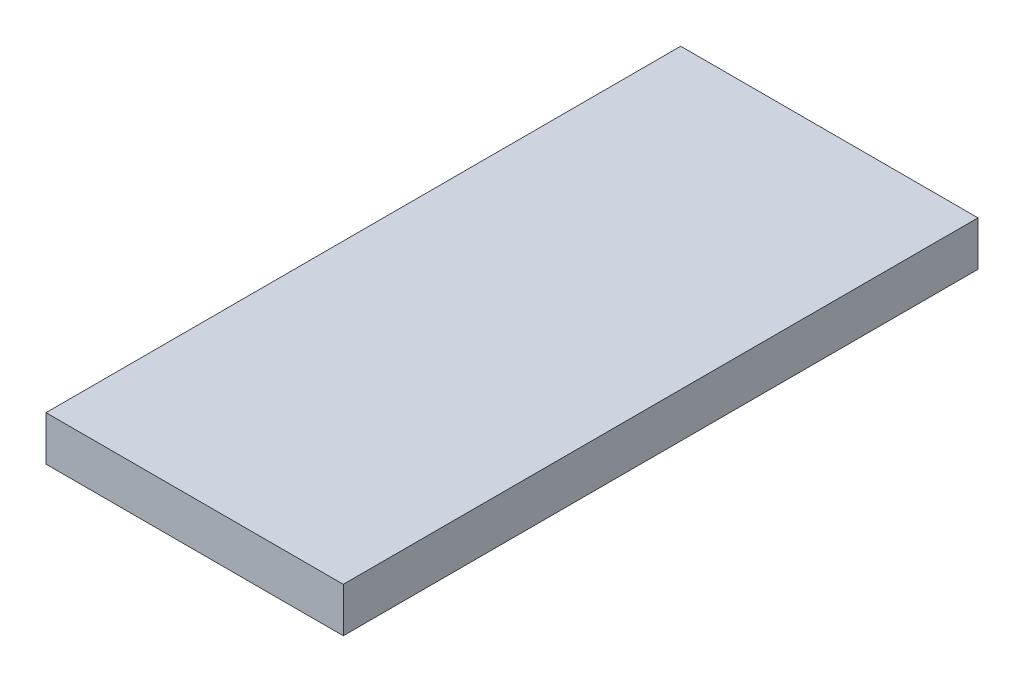
ISO-10303-21;
HEADER;
FILE_DESCRIPTION(('STEP AP214'),'2;1');
FILE_NAME('part.step','',(''),(''),'','','');
FILE_SCHEMA(('AUTOMOTIVE_DESIGN { 1 0 10303 214 1 1 1 1 }'));
ENDSEC;
DATA;
#1=APPLICATION_CONTEXT('core data for automotive mechanical design processes');
#2=APPLICATION_PROTOCOL_DEFINITION('international standard','automotive_design',2000,#1);
#3=PRODUCT_CONTEXT('',#1,'mechanical');
#4=PRODUCT('Part','Part','',(#3));
#5=PRODUCT_RELATED_PRODUCT_CATEGORY('part','',(#4));
#6=PRODUCT_DEFINITION_FORMATION('','',#4);
#7=PRODUCT_DEFINITION_CONTEXT('part definition',#1,'design');
#8=PRODUCT_DEFINITION('design','',#6,#7);
#9=PRODUCT_DEFINITION_SHAPE('','',#8);
#10=(LENGTH_UNIT() NAMED_UNIT(*) SI_UNIT(.MILLI.,.METRE.));
#11=(NAMED_UNIT(*) PLANE_ANGLE_UNIT() SI_UNIT($,.RADIAN.));
#12=(NAMED_UNIT(*) SI_UNIT($,.STERADIAN.) SOLID_ANGLE_UNIT());
#13=UNCERTAINTY_MEASURE_WITH_UNIT(LENGTH_MEASURE(1.E-05),#10,'distance_accuracy_value','');
#14=(GEOMETRIC_REPRESENTATION_CONTEXT(3) GLOBAL_UNCERTAINTY_ASSIGNED_CONTEXT((#13)) GLOBAL_UNIT_ASSIGNED_CONTEXT((#10,
#11,#12)) REPRESENTATION_CONTEXT('',''));
#15=CARTESIAN_POINT('',(0.,0.,0.));
#16=DIRECTION('',(0.,0.,1.));
#17=DIRECTION('',(1.,0.,0.));
#18=AXIS2_PLACEMENT_3D('',#15,#16,#17);
#19=CARTESIAN_POINT('',(50.,-7.5,213.5));
#20=DIRECTION('',(-1.,0.,0.));
#21=DIRECTION('',(0.,0.,1.));
#22=AXIS2_PLACEMENT_3D('',#19,#20,#21);
#23=PLANE('',#22);
#24=DIRECTION('',(0.,1.,0.));
#25=VECTOR('',#24,1.);
#26=CARTESIAN_POINT('',(50.,-7.5,0.));
#27=LINE('',#26,#25);
#28=CARTESIAN_POINT('',(50.,-7.5,0.));
#29=VERTEX_POINT('',#28);
#30=CARTESIAN_POINT('',(50.,7.5,0.));
#31=VERTEX_POINT('',#30);
#32=EDGE_CURVE('E105',#29,#31,#27,.T.);
#33=ORIENTED_EDGE('',*,*,#32,.T.);
#34=DIRECTION('',(0.,0.,-1.));
#35=VECTOR('',#34,1.);
#36=CARTESIAN_POINT('',(50.,7.5,213.5));
#37=LINE('',#36,#35);
#38=CARTESIAN_POINT('',(50.,7.5,213.5));
#39=VERTEX_POINT('',#38);
#40=EDGE_CURVE('E11',#39,#31,#37,.T.);
#41=ORIENTED_EDGE('',*,*,#40,.F.);
#42=DIRECTION('',(0.,1.,0.));
#43=VECTOR('',#42,1.);
#44=CARTESIAN_POINT('',(50.,-7.5,213.5));
#45=LINE('',#44,#43);
#46=CARTESIAN_POINT('',(50.,-7.5,213.5));
#47=VERTEX_POINT('',#46);
#48=EDGE_CURVE('E89',#47,#39,#45,.T.);
#49=ORIENTED_EDGE('',*,*,#48,.F.);
#50=DIRECTION('',(0.,0.,-1.));
#51=VECTOR('',#50,1.);
#52=CARTESIAN_POINT('',(50.,-7.5,213.5));
#53=LINE('',#52,#51);
#54=EDGE_CURVE('E98',#47,#29,#53,.T.);
#55=ORIENTED_EDGE('',*,*,#54,.T.);
#56=EDGE_LOOP('',(#33,#41,#49,#55));
#57=FACE_BOUND('',#56,.T.);
#58=ADVANCED_FACE('F39',(#57),#23,.F.);
#59=CARTESIAN_POINT('',(-50.,7.5,213.5));
#60=DIRECTION('',(0.,-1.,0.));
#61=DIRECTION('',(0.,0.,-1.));
#62=AXIS2_PLACEMENT_3D('',#59,#60,#61);
#63=PLANE('',#62);
#64=DIRECTION('',(-1.,0.,0.));
#65=VECTOR('',#64,1.);
#66=CARTESIAN_POINT('',(-50.,7.5,0.));
#67=LINE('',#66,#65);
#68=CARTESIAN_POINT('',(-50.,7.5,0.));
#69=VERTEX_POINT('',#68);
#70=EDGE_CURVE('E94',#31,#69,#67,.T.);
#71=ORIENTED_EDGE('',*,*,#70,.T.);
#72=DIRECTION('',(0.,0.,-1.));
#73=VECTOR('',#72,1.);
#74=CARTESIAN_POINT('',(-50.,7.5,213.5));
#75=LINE('',#74,#73);
#76=CARTESIAN_POINT('',(-50.,7.5,213.5));
#77=VERTEX_POINT('',#76);
#78=EDGE_CURVE('E50',#77,#69,#75,.T.);
#79=ORIENTED_EDGE('',*,*,#78,.F.);
#80=DIRECTION('',(-1.,0.,0.));
#81=VECTOR('',#80,1.);
#82=CARTESIAN_POINT('',(-50.,7.5,213.5));
#83=LINE('',#82,#81);
#84=EDGE_CURVE('E81',#39,#77,#83,.T.);
#85=ORIENTED_EDGE('',*,*,#84,.F.);
#86=ORIENTED_EDGE('',*,*,#40,.T.);
#87=EDGE_LOOP('',(#71,#79,#85,#86));
#88=FACE_BOUND('',#87,.T.);
#89=ADVANCED_FACE('F91',(#88),#63,.F.);
#90=CARTESIAN_POINT('',(-50.,-7.5,213.5));
#91=DIRECTION('',(1.,0.,0.));
#92=DIRECTION('',(0.,0.,-1.));
#93=AXIS2_PLACEMENT_3D('',#90,#91,#92);
#94=PLANE('',#93);
#95=DIRECTION('',(0.,-1.,0.));
#96=VECTOR('',#95,1.);
#97=CARTESIAN_POINT('',(-50.,-7.5,0.));
#98=LINE('',#97,#96);
#99=CARTESIAN_POINT('',(-50.,-7.5,0.));
#100=VERTEX_POINT('',#99);
#101=EDGE_CURVE('E75',#69,#100,#98,.T.);
#102=ORIENTED_EDGE('',*,*,#101,.T.);
#103=DIRECTION('',(0.,0.,-1.));
#104=VECTOR('',#103,1.);
#105=CARTESIAN_POINT('',(-50.,-7.5,213.5));
#106=LINE('',#105,#104);
#107=CARTESIAN_POINT('',(-50.,-7.5,213.5));
#108=VERTEX_POINT('',#107);
#109=EDGE_CURVE('E92',#108,#100,#106,.T.);
#110=ORIENTED_EDGE('',*,*,#109,.F.);
#111=DIRECTION('',(0.,-1.,0.));
#112=VECTOR('',#111,1.);
#113=CARTESIAN_POINT('',(-50.,-7.5,213.5));
#114=LINE('',#113,#112);
#115=EDGE_CURVE('E86',#77,#108,#114,.T.);
#116=ORIENTED_EDGE('',*,*,#115,.F.);
#117=ORIENTED_EDGE('',*,*,#78,.T.);
#118=EDGE_LOOP('',(#102,#110,#116,#117));
#119=FACE_BOUND('',#118,.T.);
#120=ADVANCED_FACE('F96',(#119),#94,.F.);
#121=CARTESIAN_POINT('',(-50.,-7.5,213.5));
#122=DIRECTION('',(0.,1.,0.));
#123=DIRECTION('',(-1.,0.,0.));
#124=AXIS2_PLACEMENT_3D('',#121,#122,#123);
#125=PLANE('',#124);
#126=DIRECTION('',(1.,0.,0.));
#127=VECTOR('',#126,1.);
#128=CARTESIAN_POINT('',(-50.,-7.5,0.));
#129=LINE('',#128,#127);
#130=EDGE_CURVE('E79',#100,#29,#129,.T.);
#131=ORIENTED_EDGE('',*,*,#130,.T.);
#132=ORIENTED_EDGE('',*,*,#54,.F.);
#133=DIRECTION('',(1.,0.,0.));
#134=VECTOR('',#133,1.);
#135=CARTESIAN_POINT('',(-50.,-7.5,213.5));
#136=LINE('',#135,#134);
#137=EDGE_CURVE('E54',#108,#47,#136,.T.);
#138=ORIENTED_EDGE('',*,*,#137,.F.);
#139=ORIENTED_EDGE('',*,*,#109,.T.);
#140=EDGE_LOOP('',(#131,#132,#138,#139));
#141=FACE_BOUND('',#140,.T.);
#142=ADVANCED_FACE('F108',(#141),#125,.F.);
#143=CARTESIAN_POINT('',(0.,0.,213.5));
#144=DIRECTION('',(0.,0.,-1.));
#145=DIRECTION('',(-1.,0.,0.));
#146=AXIS2_PLACEMENT_3D('',#143,#144,#145);
#147=PLANE('',#146);
#148=ORIENTED_EDGE('',*,*,#48,.T.);
#149=ORIENTED_EDGE('',*,*,#84,.T.);
#150=ORIENTED_EDGE('',*,*,#115,.T.);
#151=ORIENTED_EDGE('',*,*,#137,.T.);
#152=EDGE_LOOP('',(#148,#149,#150,#151));
#153=FACE_BOUND('',#152,.T.);
#154=ADVANCED_FACE('F88',(#153),#147,.F.);
#155=CARTESIAN_POINT('',(0.,0.,0.));
#156=DIRECTION('',(0.,0.,-1.));
#157=DIRECTION('',(-1.,0.,0.));
#158=AXIS2_PLACEMENT_3D('',#155,#156,#157);
#159=PLANE('',#158);
#160=ORIENTED_EDGE('',*,*,#32,.F.);
#161=ORIENTED_EDGE('',*,*,#130,.F.);
#162=ORIENTED_EDGE('',*,*,#101,.F.);
#163=ORIENTED_EDGE('',*,*,#70,.F.);
#164=EDGE_LOOP('',(#160,#161,#162,#163));
#165=FACE_BOUND('',#164,.T.);
#166=ADVANCED_FACE('F115',(#165),#159,.T.);
#167=CLOSED_SHELL('',(#58,#89,#120,#142,#154,#166));
#168=MANIFOLD_SOLID_BREP('B2',#167);
#169=ADVANCED_BREP_SHAPE_REPRESENTATION('',(#18,#168),#14);
#170=SHAPE_DEFINITION_REPRESENTATION(#9,#169);
ENDSEC;
END-ISO-10303-21;
